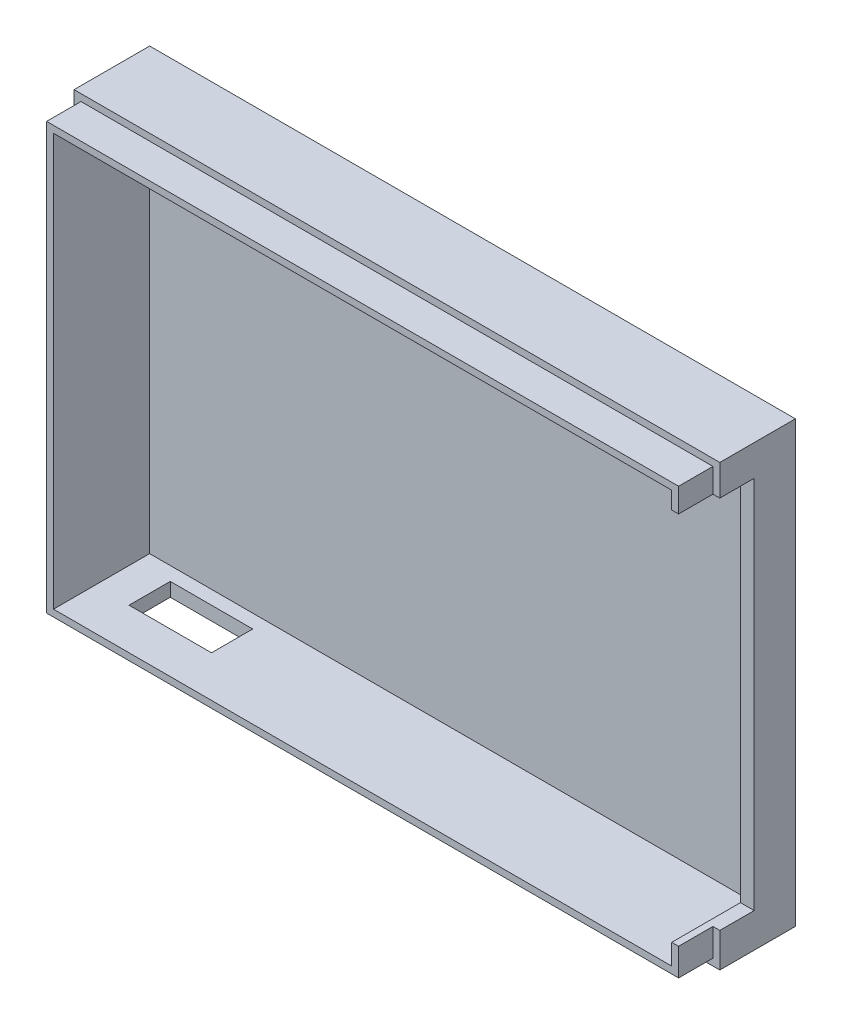
ISO-10303-21;
HEADER;
FILE_DESCRIPTION(('STEP AP214'),'2;1');
FILE_NAME('part.step','',(''),(''),'','','');
FILE_SCHEMA(('AUTOMOTIVE_DESIGN { 1 0 10303 214 1 1 1 1 }'));
ENDSEC;
DATA;
#1=APPLICATION_CONTEXT('core data for automotive mechanical design processes');
#2=APPLICATION_PROTOCOL_DEFINITION('international standard','automotive_design',2000,#1);
#3=PRODUCT_CONTEXT('',#1,'mechanical');
#4=PRODUCT('Part','Part','',(#3));
#5=PRODUCT_RELATED_PRODUCT_CATEGORY('part','',(#4));
#6=PRODUCT_DEFINITION_FORMATION('','',#4);
#7=PRODUCT_DEFINITION_CONTEXT('part definition',#1,'design');
#8=PRODUCT_DEFINITION('design','',#6,#7);
#9=PRODUCT_DEFINITION_SHAPE('','',#8);
#10=(LENGTH_UNIT() NAMED_UNIT(*) SI_UNIT(.MILLI.,.METRE.));
#11=(NAMED_UNIT(*) PLANE_ANGLE_UNIT() SI_UNIT($,.RADIAN.));
#12=(NAMED_UNIT(*) SI_UNIT($,.STERADIAN.) SOLID_ANGLE_UNIT());
#13=UNCERTAINTY_MEASURE_WITH_UNIT(LENGTH_MEASURE(1.E-05),#10,'distance_accuracy_value','');
#14=(GEOMETRIC_REPRESENTATION_CONTEXT(3) GLOBAL_UNCERTAINTY_ASSIGNED_CONTEXT((#13)) GLOBAL_UNIT_ASSIGNED_CONTEXT((#10,
#11,#12)) REPRESENTATION_CONTEXT('',''));
#15=CARTESIAN_POINT('',(0.,0.,0.));
#16=DIRECTION('',(0.,0.,1.));
#17=DIRECTION('',(1.,0.,0.));
#18=AXIS2_PLACEMENT_3D('',#15,#16,#17);
#19=CARTESIAN_POINT('',(46.,31.,11.));
#20=DIRECTION('',(1.,0.,0.));
#21=DIRECTION('',(0.,1.,0.));
#22=AXIS2_PLACEMENT_3D('',#19,#20,#21);
#23=PLANE('',#22);
#24=DIRECTION('',(0.,0.,1.));
#25=VECTOR('',#24,1.);
#26=CARTESIAN_POINT('',(46.,-27.,16.));
#27=LINE('',#26,#25);
#28=CARTESIAN_POINT('',(46.,-27.,11.));
#29=VERTEX_POINT('',#28);
#30=CARTESIAN_POINT('',(46.,-27.,16.));
#31=VERTEX_POINT('',#30);
#32=EDGE_CURVE('E362',#29,#31,#27,.T.);
#33=ORIENTED_EDGE('',*,*,#32,.T.);
#34=DIRECTION('',(0.,1.,0.));
#35=VECTOR('',#34,1.);
#36=CARTESIAN_POINT('',(46.,31.,16.));
#37=LINE('',#36,#35);
#38=CARTESIAN_POINT('',(46.,-31.,16.));
#39=VERTEX_POINT('',#38);
#40=EDGE_CURVE('E295',#39,#31,#37,.T.);
#41=ORIENTED_EDGE('',*,*,#40,.F.);
#42=DIRECTION('',(0.,0.,1.));
#43=VECTOR('',#42,1.);
#44=CARTESIAN_POINT('',(46.,-31.,11.));
#45=LINE('',#44,#43);
#46=CARTESIAN_POINT('',(46.,-31.,11.));
#47=VERTEX_POINT('',#46);
#48=EDGE_CURVE('E285',#47,#39,#45,.T.);
#49=ORIENTED_EDGE('',*,*,#48,.F.);
#50=DIRECTION('',(0.,1.,0.));
#51=VECTOR('',#50,1.);
#52=CARTESIAN_POINT('',(46.,31.,11.));
#53=LINE('',#52,#51);
#54=EDGE_CURVE('E307',#47,#29,#53,.T.);
#55=ORIENTED_EDGE('',*,*,#54,.T.);
#56=EDGE_LOOP('',(#33,#41,#49,#55));
#57=FACE_BOUND('',#56,.T.);
#58=ADVANCED_FACE('F32',(#57),#23,.T.);
#59=CARTESIAN_POINT('',(0.,0.,16.));
#60=DIRECTION('',(0.,0.,1.));
#61=DIRECTION('',(1.,0.,0.));
#62=AXIS2_PLACEMENT_3D('',#59,#60,#61);
#63=PLANE('',#62);
#64=DIRECTION('',(-1.,0.,0.));
#65=VECTOR('',#64,1.);
#66=CARTESIAN_POINT('',(47.001,-27.,16.));
#67=LINE('',#66,#65);
#68=CARTESIAN_POINT('',(45.,-27.,16.));
#69=VERTEX_POINT('',#68);
#70=EDGE_CURVE('E188',#31,#69,#67,.T.);
#71=ORIENTED_EDGE('',*,*,#70,.T.);
#72=DIRECTION('',(0.,1.,0.));
#73=VECTOR('',#72,1.);
#74=CARTESIAN_POINT('',(45.,30.,16.));
#75=LINE('',#74,#73);
#76=CARTESIAN_POINT('',(45.,-30.,16.));
#77=VERTEX_POINT('',#76);
#78=EDGE_CURVE('E234',#77,#69,#75,.T.);
#79=ORIENTED_EDGE('',*,*,#78,.F.);
#80=DIRECTION('',(1.,0.,0.));
#81=VECTOR('',#80,1.);
#82=CARTESIAN_POINT('',(-45.,-30.,16.));
#83=LINE('',#82,#81);
#84=CARTESIAN_POINT('',(-45.,-30.,16.));
#85=VERTEX_POINT('',#84);
#86=EDGE_CURVE('E230',#85,#77,#83,.T.);
#87=ORIENTED_EDGE('',*,*,#86,.F.);
#88=DIRECTION('',(0.,-1.,0.));
#89=VECTOR('',#88,1.);
#90=CARTESIAN_POINT('',(-45.,30.,16.));
#91=LINE('',#90,#89);
#92=CARTESIAN_POINT('',(-45.,30.,16.));
#93=VERTEX_POINT('',#92);
#94=EDGE_CURVE('E214',#93,#85,#91,.T.);
#95=ORIENTED_EDGE('',*,*,#94,.F.);
#96=DIRECTION('',(-1.,0.,0.));
#97=VECTOR('',#96,1.);
#98=CARTESIAN_POINT('',(-45.,30.,16.));
#99=LINE('',#98,#97);
#100=CARTESIAN_POINT('',(45.,30.,16.));
#101=VERTEX_POINT('',#100);
#102=EDGE_CURVE('E219',#101,#93,#99,.T.);
#103=ORIENTED_EDGE('',*,*,#102,.F.);
#104=CARTESIAN_POINT('',(45.,27.5,16.));
#105=VERTEX_POINT('',#104);
#106=EDGE_CURVE('E233',#105,#101,#75,.T.);
#107=ORIENTED_EDGE('',*,*,#106,.F.);
#108=DIRECTION('',(-1.,0.,0.));
#109=VECTOR('',#108,1.);
#110=CARTESIAN_POINT('',(47.001,27.5,16.));
#111=LINE('',#110,#109);
#112=CARTESIAN_POINT('',(46.,27.5,16.));
#113=VERTEX_POINT('',#112);
#114=EDGE_CURVE('E346',#113,#105,#111,.T.);
#115=ORIENTED_EDGE('',*,*,#114,.F.);
#116=CARTESIAN_POINT('',(46.,31.,16.));
#117=VERTEX_POINT('',#116);
#118=EDGE_CURVE('E298',#113,#117,#37,.T.);
#119=ORIENTED_EDGE('',*,*,#118,.T.);
#120=DIRECTION('',(-1.,0.,0.));
#121=VECTOR('',#120,1.);
#122=CARTESIAN_POINT('',(-46.,31.,16.));
#123=LINE('',#122,#121);
#124=CARTESIAN_POINT('',(-46.,31.,16.));
#125=VERTEX_POINT('',#124);
#126=EDGE_CURVE('E291',#117,#125,#123,.T.);
#127=ORIENTED_EDGE('',*,*,#126,.T.);
#128=DIRECTION('',(0.,-1.,0.));
#129=VECTOR('',#128,1.);
#130=CARTESIAN_POINT('',(-46.,31.,16.));
#131=LINE('',#130,#129);
#132=CARTESIAN_POINT('',(-46.,-31.,16.));
#133=VERTEX_POINT('',#132);
#134=EDGE_CURVE('E302',#125,#133,#131,.T.);
#135=ORIENTED_EDGE('',*,*,#134,.T.);
#136=DIRECTION('',(1.,0.,0.));
#137=VECTOR('',#136,1.);
#138=CARTESIAN_POINT('',(-46.,-31.,16.));
#139=LINE('',#138,#137);
#140=EDGE_CURVE('E299',#133,#39,#139,.T.);
#141=ORIENTED_EDGE('',*,*,#140,.T.);
#142=ORIENTED_EDGE('',*,*,#40,.T.);
#143=EDGE_LOOP('',(#71,#79,#87,#95,#103,#107,#115,#119,#127,#135,#141,#142));
#144=FACE_BOUND('',#143,.T.);
#145=ADVANCED_FACE('F391',(#144),#63,.T.);
#146=CARTESIAN_POINT('',(-45.,30.,2.));
#147=DIRECTION('',(-1.,0.,0.));
#148=DIRECTION('',(0.,-1.,0.));
#149=AXIS2_PLACEMENT_3D('',#146,#147,#148);
#150=PLANE('',#149);
#151=ORIENTED_EDGE('',*,*,#94,.T.);
#152=DIRECTION('',(0.,0.,1.));
#153=VECTOR('',#152,1.);
#154=CARTESIAN_POINT('',(-45.,-30.,2.));
#155=LINE('',#154,#153);
#156=CARTESIAN_POINT('',(-45.,-30.,2.));
#157=VERTEX_POINT('',#156);
#158=EDGE_CURVE('E228',#157,#85,#155,.T.);
#159=ORIENTED_EDGE('',*,*,#158,.F.);
#160=DIRECTION('',(0.,-1.,0.));
#161=VECTOR('',#160,1.);
#162=CARTESIAN_POINT('',(-45.,30.,2.));
#163=LINE('',#162,#161);
#164=CARTESIAN_POINT('',(-45.,30.,2.));
#165=VERTEX_POINT('',#164);
#166=EDGE_CURVE('E215',#165,#157,#163,.T.);
#167=ORIENTED_EDGE('',*,*,#166,.F.);
#168=DIRECTION('',(0.,0.,1.));
#169=VECTOR('',#168,1.);
#170=CARTESIAN_POINT('',(-45.,30.,2.));
#171=LINE('',#170,#169);
#172=EDGE_CURVE('E239',#165,#93,#171,.T.);
#173=ORIENTED_EDGE('',*,*,#172,.T.);
#174=EDGE_LOOP('',(#151,#159,#167,#173));
#175=FACE_BOUND('',#174,.T.);
#176=ADVANCED_FACE('F428',(#175),#150,.F.);
#177=CARTESIAN_POINT('',(-45.,30.,2.));
#178=DIRECTION('',(0.,1.,0.));
#179=DIRECTION('',(0.,0.,1.));
#180=AXIS2_PLACEMENT_3D('',#177,#178,#179);
#181=PLANE('',#180);
#182=ORIENTED_EDGE('',*,*,#102,.T.);
#183=ORIENTED_EDGE('',*,*,#172,.F.);
#184=DIRECTION('',(-1.,0.,0.));
#185=VECTOR('',#184,1.);
#186=CARTESIAN_POINT('',(-45.,30.,2.));
#187=LINE('',#186,#185);
#188=CARTESIAN_POINT('',(45.,30.,2.));
#189=VERTEX_POINT('',#188);
#190=EDGE_CURVE('E225',#189,#165,#187,.T.);
#191=ORIENTED_EDGE('',*,*,#190,.F.);
#192=DIRECTION('',(0.,0.,1.));
#193=VECTOR('',#192,1.);
#194=CARTESIAN_POINT('',(45.,30.,2.));
#195=LINE('',#194,#193);
#196=EDGE_CURVE('E242',#189,#101,#195,.T.);
#197=ORIENTED_EDGE('',*,*,#196,.T.);
#198=EDGE_LOOP('',(#182,#183,#191,#197));
#199=FACE_BOUND('',#198,.T.);
#200=ADVANCED_FACE('F400',(#199),#181,.F.);
#201=CARTESIAN_POINT('',(45.,30.,2.));
#202=DIRECTION('',(1.,0.,0.));
#203=DIRECTION('',(0.,1.,0.));
#204=AXIS2_PLACEMENT_3D('',#201,#202,#203);
#205=PLANE('',#204);
#206=ORIENTED_EDGE('',*,*,#78,.T.);
#207=DIRECTION('',(0.,0.,1.));
#208=VECTOR('',#207,1.);
#209=CARTESIAN_POINT('',(45.,-27.,16.));
#210=LINE('',#209,#208);
#211=CARTESIAN_POINT('',(45.,-27.,6.00000000000001));
#212=VERTEX_POINT('',#211);
#213=EDGE_CURVE('E348',#212,#69,#210,.T.);
#214=ORIENTED_EDGE('',*,*,#213,.F.);
#215=DIRECTION('',(0.,-1.,0.));
#216=VECTOR('',#215,1.);
#217=CARTESIAN_POINT('',(45.,27.5,6.));
#218=LINE('',#217,#216);
#219=CARTESIAN_POINT('',(45.,27.5,6.));
#220=VERTEX_POINT('',#219);
#221=EDGE_CURVE('E355',#220,#212,#218,.T.);
#222=ORIENTED_EDGE('',*,*,#221,.F.);
#223=DIRECTION('',(0.,0.,-1.));
#224=VECTOR('',#223,1.);
#225=CARTESIAN_POINT('',(45.,27.5,16.));
#226=LINE('',#225,#224);
#227=EDGE_CURVE('E358',#105,#220,#226,.T.);
#228=ORIENTED_EDGE('',*,*,#227,.F.);
#229=ORIENTED_EDGE('',*,*,#106,.T.);
#230=ORIENTED_EDGE('',*,*,#196,.F.);
#231=DIRECTION('',(0.,1.,0.));
#232=VECTOR('',#231,1.);
#233=CARTESIAN_POINT('',(45.,30.,2.));
#234=LINE('',#233,#232);
#235=CARTESIAN_POINT('',(45.,-30.,2.));
#236=VERTEX_POINT('',#235);
#237=EDGE_CURVE('E222',#236,#189,#234,.T.);
#238=ORIENTED_EDGE('',*,*,#237,.F.);
#239=DIRECTION('',(0.,0.,1.));
#240=VECTOR('',#239,1.);
#241=CARTESIAN_POINT('',(45.,-30.,2.));
#242=LINE('',#241,#240);
#243=EDGE_CURVE('E245',#236,#77,#242,.T.);
#244=ORIENTED_EDGE('',*,*,#243,.T.);
#245=EDGE_LOOP('',(#206,#214,#222,#228,#229,#230,#238,#244));
#246=FACE_BOUND('',#245,.T.);
#247=ADVANCED_FACE('F395',(#246),#205,.F.);
#248=CARTESIAN_POINT('',(-45.,-30.,2.));
#249=DIRECTION('',(0.,-1.,0.));
#250=DIRECTION('',(0.,0.,-1.));
#251=AXIS2_PLACEMENT_3D('',#248,#249,#250);
#252=PLANE('',#251);
#253=DIRECTION('',(1.,0.,0.));
#254=VECTOR('',#253,1.);
#255=CARTESIAN_POINT('',(-40.,-30.,10.));
#256=LINE('',#255,#254);
#257=CARTESIAN_POINT('',(-40.,-30.,10.));
#258=VERTEX_POINT('',#257);
#259=CARTESIAN_POINT('',(-28.,-30.,10.));
#260=VERTEX_POINT('',#259);
#261=EDGE_CURVE('E326',#258,#260,#256,.T.);
#262=ORIENTED_EDGE('',*,*,#261,.F.);
#263=DIRECTION('',(0.,0.,1.));
#264=VECTOR('',#263,1.);
#265=CARTESIAN_POINT('',(-40.,-30.,10.));
#266=LINE('',#265,#264);
#267=CARTESIAN_POINT('',(-40.,-30.,4.));
#268=VERTEX_POINT('',#267);
#269=EDGE_CURVE('E329',#268,#258,#266,.T.);
#270=ORIENTED_EDGE('',*,*,#269,.F.);
#271=DIRECTION('',(-1.,0.,0.));
#272=VECTOR('',#271,1.);
#273=CARTESIAN_POINT('',(-40.,-30.,4.));
#274=LINE('',#273,#272);
#275=CARTESIAN_POINT('',(-28.,-30.,4.));
#276=VERTEX_POINT('',#275);
#277=EDGE_CURVE('E332',#276,#268,#274,.T.);
#278=ORIENTED_EDGE('',*,*,#277,.F.);
#279=DIRECTION('',(0.,0.,-1.));
#280=VECTOR('',#279,1.);
#281=CARTESIAN_POINT('',(-28.,-30.,10.));
#282=LINE('',#281,#280);
#283=EDGE_CURVE('E55',#260,#276,#282,.T.);
#284=ORIENTED_EDGE('',*,*,#283,.F.);
#285=EDGE_LOOP('',(#262,#270,#278,#284));
#286=FACE_BOUND('',#285,.T.);
#287=ORIENTED_EDGE('',*,*,#86,.T.);
#288=ORIENTED_EDGE('',*,*,#243,.F.);
#289=DIRECTION('',(1.,0.,0.));
#290=VECTOR('',#289,1.);
#291=CARTESIAN_POINT('',(-45.,-30.,2.));
#292=LINE('',#291,#290);
#293=EDGE_CURVE('E218',#157,#236,#292,.T.);
#294=ORIENTED_EDGE('',*,*,#293,.F.);
#295=ORIENTED_EDGE('',*,*,#158,.T.);
#296=EDGE_LOOP('',(#287,#288,#294,#295));
#297=FACE_BOUND('',#296,.T.);
#298=ADVANCED_FACE('F409',(#286,#297),#252,.F.);
#299=CARTESIAN_POINT('',(0.,0.,2.));
#300=DIRECTION('',(0.,0.,1.));
#301=DIRECTION('',(1.,0.,0.));
#302=AXIS2_PLACEMENT_3D('',#299,#300,#301);
#303=PLANE('',#302);
#304=ORIENTED_EDGE('',*,*,#166,.T.);
#305=ORIENTED_EDGE('',*,*,#293,.T.);
#306=ORIENTED_EDGE('',*,*,#237,.T.);
#307=ORIENTED_EDGE('',*,*,#190,.T.);
#308=EDGE_LOOP('',(#304,#305,#306,#307));
#309=FACE_BOUND('',#308,.T.);
#310=ADVANCED_FACE('F403',(#309),#303,.T.);
#311=CARTESIAN_POINT('',(0.,0.,11.));
#312=DIRECTION('',(0.,0.,1.));
#313=DIRECTION('',(1.,0.,0.));
#314=AXIS2_PLACEMENT_3D('',#311,#312,#313);
#315=PLANE('',#314);
#316=DIRECTION('',(-1.,0.,0.));
#317=VECTOR('',#316,1.);
#318=CARTESIAN_POINT('',(47.001,-27.,11.));
#319=LINE('',#318,#317);
#320=CARTESIAN_POINT('',(47.,-27.,11.));
#321=VERTEX_POINT('',#320);
#322=EDGE_CURVE('E360',#321,#29,#319,.T.);
#323=ORIENTED_EDGE('',*,*,#322,.T.);
#324=ORIENTED_EDGE('',*,*,#54,.F.);
#325=DIRECTION('',(1.,0.,0.));
#326=VECTOR('',#325,1.);
#327=CARTESIAN_POINT('',(-46.,-31.,11.));
#328=LINE('',#327,#326);
#329=CARTESIAN_POINT('',(-46.,-31.,11.));
#330=VERTEX_POINT('',#329);
#331=EDGE_CURVE('E310',#330,#47,#328,.T.);
#332=ORIENTED_EDGE('',*,*,#331,.F.);
#333=DIRECTION('',(0.,-1.,0.));
#334=VECTOR('',#333,1.);
#335=CARTESIAN_POINT('',(-46.,31.,11.));
#336=LINE('',#335,#334);
#337=CARTESIAN_POINT('',(-46.,31.,11.));
#338=VERTEX_POINT('',#337);
#339=EDGE_CURVE('E294',#338,#330,#336,.T.);
#340=ORIENTED_EDGE('',*,*,#339,.F.);
#341=DIRECTION('',(-1.,0.,0.));
#342=VECTOR('',#341,1.);
#343=CARTESIAN_POINT('',(-46.,31.,11.));
#344=LINE('',#343,#342);
#345=CARTESIAN_POINT('',(46.,31.,11.));
#346=VERTEX_POINT('',#345);
#347=EDGE_CURVE('E286',#346,#338,#344,.T.);
#348=ORIENTED_EDGE('',*,*,#347,.F.);
#349=CARTESIAN_POINT('',(46.,27.5,11.));
#350=VERTEX_POINT('',#349);
#351=EDGE_CURVE('E197',#350,#346,#53,.T.);
#352=ORIENTED_EDGE('',*,*,#351,.F.);
#353=DIRECTION('',(1.,0.,0.));
#354=VECTOR('',#353,1.);
#355=CARTESIAN_POINT('',(47.001,27.5,11.));
#356=LINE('',#355,#354);
#357=CARTESIAN_POINT('',(47.,27.5,11.));
#358=VERTEX_POINT('',#357);
#359=EDGE_CURVE('E182',#350,#358,#356,.T.);
#360=ORIENTED_EDGE('',*,*,#359,.T.);
#361=DIRECTION('',(0.,1.,0.));
#362=VECTOR('',#361,1.);
#363=CARTESIAN_POINT('',(47.,32.,11.));
#364=LINE('',#363,#362);
#365=CARTESIAN_POINT('',(47.,32.,11.));
#366=VERTEX_POINT('',#365);
#367=EDGE_CURVE('E194',#358,#366,#364,.T.);
#368=ORIENTED_EDGE('',*,*,#367,.T.);
#369=DIRECTION('',(-1.,0.,0.));
#370=VECTOR('',#369,1.);
#371=CARTESIAN_POINT('',(-47.,32.,11.));
#372=LINE('',#371,#370);
#373=CARTESIAN_POINT('',(-47.,32.,11.));
#374=VERTEX_POINT('',#373);
#375=EDGE_CURVE('E208',#366,#374,#372,.T.);
#376=ORIENTED_EDGE('',*,*,#375,.T.);
#377=DIRECTION('',(0.,-1.,0.));
#378=VECTOR('',#377,1.);
#379=CARTESIAN_POINT('',(-47.,32.,11.));
#380=LINE('',#379,#378);
#381=CARTESIAN_POINT('',(-47.,-32.,11.));
#382=VERTEX_POINT('',#381);
#383=EDGE_CURVE('E209',#374,#382,#380,.T.);
#384=ORIENTED_EDGE('',*,*,#383,.T.);
#385=DIRECTION('',(1.,0.,0.));
#386=VECTOR('',#385,1.);
#387=CARTESIAN_POINT('',(-47.,-32.,11.));
#388=LINE('',#387,#386);
#389=CARTESIAN_POINT('',(47.,-32.,11.));
#390=VERTEX_POINT('',#389);
#391=EDGE_CURVE('E205',#382,#390,#388,.T.);
#392=ORIENTED_EDGE('',*,*,#391,.T.);
#393=EDGE_CURVE('E204',#390,#321,#364,.T.);
#394=ORIENTED_EDGE('',*,*,#393,.T.);
#395=EDGE_LOOP('',(#323,#324,#332,#340,#348,#352,#360,#368,#376,#384,#392,#394));
#396=FACE_BOUND('',#395,.T.);
#397=ADVANCED_FACE('F193',(#396),#315,.T.);
#398=CARTESIAN_POINT('',(-46.,31.,11.));
#399=DIRECTION('',(-1.,0.,0.));
#400=DIRECTION('',(0.,-1.,0.));
#401=AXIS2_PLACEMENT_3D('',#398,#399,#400);
#402=PLANE('',#401);
#403=ORIENTED_EDGE('',*,*,#134,.F.);
#404=DIRECTION('',(0.,0.,1.));
#405=VECTOR('',#404,1.);
#406=CARTESIAN_POINT('',(-46.,31.,11.));
#407=LINE('',#406,#405);
#408=EDGE_CURVE('E279',#338,#125,#407,.T.);
#409=ORIENTED_EDGE('',*,*,#408,.F.);
#410=ORIENTED_EDGE('',*,*,#339,.T.);
#411=DIRECTION('',(0.,0.,1.));
#412=VECTOR('',#411,1.);
#413=CARTESIAN_POINT('',(-46.,-31.,11.));
#414=LINE('',#413,#412);
#415=EDGE_CURVE('E283',#330,#133,#414,.T.);
#416=ORIENTED_EDGE('',*,*,#415,.T.);
#417=EDGE_LOOP('',(#403,#409,#410,#416));
#418=FACE_BOUND('',#417,.T.);
#419=ADVANCED_FACE('F379',(#418),#402,.T.);
#420=CARTESIAN_POINT('',(-46.,31.,11.));
#421=DIRECTION('',(0.,1.,0.));
#422=DIRECTION('',(0.,0.,1.));
#423=AXIS2_PLACEMENT_3D('',#420,#421,#422);
#424=PLANE('',#423);
#425=ORIENTED_EDGE('',*,*,#126,.F.);
#426=DIRECTION('',(0.,0.,1.));
#427=VECTOR('',#426,1.);
#428=CARTESIAN_POINT('',(46.,31.,11.));
#429=LINE('',#428,#427);
#430=EDGE_CURVE('E280',#346,#117,#429,.T.);
#431=ORIENTED_EDGE('',*,*,#430,.F.);
#432=ORIENTED_EDGE('',*,*,#347,.T.);
#433=ORIENTED_EDGE('',*,*,#408,.T.);
#434=EDGE_LOOP('',(#425,#431,#432,#433));
#435=FACE_BOUND('',#434,.T.);
#436=ADVANCED_FACE('F382',(#435),#424,.T.);
#437=DIRECTION('',(0.,0.,-1.));
#438=VECTOR('',#437,1.);
#439=CARTESIAN_POINT('',(46.,27.5,16.));
#440=LINE('',#439,#438);
#441=EDGE_CURVE('E198',#113,#350,#440,.T.);
#442=ORIENTED_EDGE('',*,*,#441,.T.);
#443=ORIENTED_EDGE('',*,*,#351,.T.);
#444=ORIENTED_EDGE('',*,*,#430,.T.);
#445=ORIENTED_EDGE('',*,*,#118,.F.);
#446=EDGE_LOOP('',(#442,#443,#444,#445));
#447=FACE_BOUND('',#446,.T.);
#448=ADVANCED_FACE('F386',(#447),#23,.T.);
#449=CARTESIAN_POINT('',(-46.,-31.,11.));
#450=DIRECTION('',(0.,-1.,0.));
#451=DIRECTION('',(1.,0.,0.));
#452=AXIS2_PLACEMENT_3D('',#449,#450,#451);
#453=PLANE('',#452);
#454=ORIENTED_EDGE('',*,*,#140,.F.);
#455=ORIENTED_EDGE('',*,*,#415,.F.);
#456=ORIENTED_EDGE('',*,*,#331,.T.);
#457=ORIENTED_EDGE('',*,*,#48,.T.);
#458=EDGE_LOOP('',(#454,#455,#456,#457));
#459=FACE_BOUND('',#458,.T.);
#460=ADVANCED_FACE('F375',(#459),#453,.T.);
#461=CARTESIAN_POINT('',(0.,0.,0.));
#462=DIRECTION('',(0.,0.,1.));
#463=DIRECTION('',(1.,0.,0.));
#464=AXIS2_PLACEMENT_3D('',#461,#462,#463);
#465=PLANE('',#464);
#466=DIRECTION('',(0.,-1.,0.));
#467=VECTOR('',#466,1.);
#468=CARTESIAN_POINT('',(-47.,32.,0.));
#469=LINE('',#468,#467);
#470=CARTESIAN_POINT('',(-47.,32.,0.));
#471=VERTEX_POINT('',#470);
#472=CARTESIAN_POINT('',(-47.,-32.,0.));
#473=VERTEX_POINT('',#472);
#474=EDGE_CURVE('E241',#471,#473,#469,.T.);
#475=ORIENTED_EDGE('',*,*,#474,.F.);
#476=DIRECTION('',(-1.,0.,0.));
#477=VECTOR('',#476,1.);
#478=CARTESIAN_POINT('',(-47.,32.,0.));
#479=LINE('',#478,#477);
#480=CARTESIAN_POINT('',(47.,32.,0.));
#481=VERTEX_POINT('',#480);
#482=EDGE_CURVE('E256',#481,#471,#479,.T.);
#483=ORIENTED_EDGE('',*,*,#482,.F.);
#484=DIRECTION('',(0.,1.,0.));
#485=VECTOR('',#484,1.);
#486=CARTESIAN_POINT('',(47.,32.,0.));
#487=LINE('',#486,#485);
#488=CARTESIAN_POINT('',(47.,-32.,0.));
#489=VERTEX_POINT('',#488);
#490=EDGE_CURVE('E254',#489,#481,#487,.T.);
#491=ORIENTED_EDGE('',*,*,#490,.F.);
#492=DIRECTION('',(1.,0.,0.));
#493=VECTOR('',#492,1.);
#494=CARTESIAN_POINT('',(-47.,-32.,0.));
#495=LINE('',#494,#493);
#496=EDGE_CURVE('E251',#473,#489,#495,.T.);
#497=ORIENTED_EDGE('',*,*,#496,.F.);
#498=EDGE_LOOP('',(#475,#483,#491,#497));
#499=FACE_BOUND('',#498,.T.);
#500=ADVANCED_FACE('F273',(#499),#465,.F.);
#501=CARTESIAN_POINT('',(-47.,32.,16.));
#502=DIRECTION('',(0.,-1.,0.));
#503=DIRECTION('',(0.,0.,-1.));
#504=AXIS2_PLACEMENT_3D('',#501,#502,#503);
#505=PLANE('',#504);
#506=ORIENTED_EDGE('',*,*,#375,.F.);
#507=DIRECTION('',(0.,0.,-1.));
#508=VECTOR('',#507,1.);
#509=CARTESIAN_POINT('',(47.,32.,16.));
#510=LINE('',#509,#508);
#511=EDGE_CURVE('E203',#366,#481,#510,.T.);
#512=ORIENTED_EDGE('',*,*,#511,.T.);
#513=ORIENTED_EDGE('',*,*,#482,.T.);
#514=DIRECTION('',(0.,0.,-1.));
#515=VECTOR('',#514,1.);
#516=CARTESIAN_POINT('',(-47.,32.,16.));
#517=LINE('',#516,#515);
#518=EDGE_CURVE('E259',#374,#471,#517,.T.);
#519=ORIENTED_EDGE('',*,*,#518,.F.);
#520=EDGE_LOOP('',(#506,#512,#513,#519));
#521=FACE_BOUND('',#520,.T.);
#522=ADVANCED_FACE('F276',(#521),#505,.F.);
#523=CARTESIAN_POINT('',(47.,32.,16.));
#524=DIRECTION('',(-1.,0.,0.));
#525=DIRECTION('',(0.,-1.,0.));
#526=AXIS2_PLACEMENT_3D('',#523,#524,#525);
#527=PLANE('',#526);
#528=DIRECTION('',(0.,1.,0.));
#529=VECTOR('',#528,1.);
#530=CARTESIAN_POINT('',(47.,27.5,6.));
#531=LINE('',#530,#529);
#532=CARTESIAN_POINT('',(47.,-27.,6.00000000000001));
#533=VERTEX_POINT('',#532);
#534=CARTESIAN_POINT('',(47.,27.5,6.));
#535=VERTEX_POINT('',#534);
#536=EDGE_CURVE('E47',#533,#535,#531,.T.);
#537=ORIENTED_EDGE('',*,*,#536,.F.);
#538=DIRECTION('',(0.,0.,-1.));
#539=VECTOR('',#538,1.);
#540=CARTESIAN_POINT('',(47.,-27.,16.));
#541=LINE('',#540,#539);
#542=EDGE_CURVE('E365',#321,#533,#541,.T.);
#543=ORIENTED_EDGE('',*,*,#542,.F.);
#544=ORIENTED_EDGE('',*,*,#393,.F.);
#545=DIRECTION('',(0.,0.,-1.));
#546=VECTOR('',#545,1.);
#547=CARTESIAN_POINT('',(47.,-32.,16.));
#548=LINE('',#547,#546);
#549=EDGE_CURVE('E40',#390,#489,#548,.T.);
#550=ORIENTED_EDGE('',*,*,#549,.T.);
#551=ORIENTED_EDGE('',*,*,#490,.T.);
#552=ORIENTED_EDGE('',*,*,#511,.F.);
#553=ORIENTED_EDGE('',*,*,#367,.F.);
#554=DIRECTION('',(0.,0.,1.));
#555=VECTOR('',#554,1.);
#556=CARTESIAN_POINT('',(47.,27.5,16.));
#557=LINE('',#556,#555);
#558=EDGE_CURVE('E179',#535,#358,#557,.T.);
#559=ORIENTED_EDGE('',*,*,#558,.F.);
#560=EDGE_LOOP('',(#537,#543,#544,#550,#551,#552,#553,#559));
#561=FACE_BOUND('',#560,.T.);
#562=ADVANCED_FACE('F201',(#561),#527,.F.);
#563=CARTESIAN_POINT('',(-47.,-32.,16.));
#564=DIRECTION('',(0.,1.,0.));
#565=DIRECTION('',(0.,0.,1.));
#566=AXIS2_PLACEMENT_3D('',#563,#564,#565);
#567=PLANE('',#566);
#568=DIRECTION('',(1.,0.,0.));
#569=VECTOR('',#568,1.);
#570=CARTESIAN_POINT('',(-40.,-32.,4.));
#571=LINE('',#570,#569);
#572=CARTESIAN_POINT('',(-40.,-32.,4.));
#573=VERTEX_POINT('',#572);
#574=CARTESIAN_POINT('',(-28.,-32.,4.));
#575=VERTEX_POINT('',#574);
#576=EDGE_CURVE('E334',#573,#575,#571,.T.);
#577=ORIENTED_EDGE('',*,*,#576,.F.);
#578=DIRECTION('',(0.,0.,-1.));
#579=VECTOR('',#578,1.);
#580=CARTESIAN_POINT('',(-40.,-32.,10.));
#581=LINE('',#580,#579);
#582=CARTESIAN_POINT('',(-40.,-32.,10.));
#583=VERTEX_POINT('',#582);
#584=EDGE_CURVE('E321',#583,#573,#581,.T.);
#585=ORIENTED_EDGE('',*,*,#584,.F.);
#586=DIRECTION('',(-1.,0.,0.));
#587=VECTOR('',#586,1.);
#588=CARTESIAN_POINT('',(-40.,-32.,10.));
#589=LINE('',#588,#587);
#590=CARTESIAN_POINT('',(-28.,-32.,10.));
#591=VERTEX_POINT('',#590);
#592=EDGE_CURVE('E340',#591,#583,#589,.T.);
#593=ORIENTED_EDGE('',*,*,#592,.F.);
#594=DIRECTION('',(0.,0.,1.));
#595=VECTOR('',#594,1.);
#596=CARTESIAN_POINT('',(-28.,-32.,10.));
#597=LINE('',#596,#595);
#598=EDGE_CURVE('E337',#575,#591,#597,.T.);
#599=ORIENTED_EDGE('',*,*,#598,.F.);
#600=EDGE_LOOP('',(#577,#585,#593,#599));
#601=FACE_BOUND('',#600,.T.);
#602=ORIENTED_EDGE('',*,*,#391,.F.);
#603=DIRECTION('',(0.,0.,-1.));
#604=VECTOR('',#603,1.);
#605=CARTESIAN_POINT('',(-47.,-32.,16.));
#606=LINE('',#605,#604);
#607=EDGE_CURVE('E11',#382,#473,#606,.T.);
#608=ORIENTED_EDGE('',*,*,#607,.T.);
#609=ORIENTED_EDGE('',*,*,#496,.T.);
#610=ORIENTED_EDGE('',*,*,#549,.F.);
#611=EDGE_LOOP('',(#602,#608,#609,#610));
#612=FACE_BOUND('',#611,.T.);
#613=ADVANCED_FACE('F269',(#601,#612),#567,.F.);
#614=CARTESIAN_POINT('',(-47.,32.,16.));
#615=DIRECTION('',(1.,0.,0.));
#616=DIRECTION('',(0.,1.,0.));
#617=AXIS2_PLACEMENT_3D('',#614,#615,#616);
#618=PLANE('',#617);
#619=ORIENTED_EDGE('',*,*,#383,.F.);
#620=ORIENTED_EDGE('',*,*,#518,.T.);
#621=ORIENTED_EDGE('',*,*,#474,.T.);
#622=ORIENTED_EDGE('',*,*,#607,.F.);
#623=EDGE_LOOP('',(#619,#620,#621,#622));
#624=FACE_BOUND('',#623,.T.);
#625=ADVANCED_FACE('F34',(#624),#618,.F.);
#626=CARTESIAN_POINT('',(-40.,32.001,10.));
#627=DIRECTION('',(-1.,0.,0.));
#628=DIRECTION('',(0.,0.,1.));
#629=AXIS2_PLACEMENT_3D('',#626,#627,#628);
#630=PLANE('',#629);
#631=ORIENTED_EDGE('',*,*,#269,.T.);
#632=DIRECTION('',(0.,-1.,0.));
#633=VECTOR('',#632,1.);
#634=CARTESIAN_POINT('',(-40.,32.001,10.));
#635=LINE('',#634,#633);
#636=EDGE_CURVE('E318',#258,#583,#635,.T.);
#637=ORIENTED_EDGE('',*,*,#636,.T.);
#638=ORIENTED_EDGE('',*,*,#584,.T.);
#639=DIRECTION('',(0.,-1.,0.));
#640=VECTOR('',#639,1.);
#641=CARTESIAN_POINT('',(-40.,32.001,4.));
#642=LINE('',#641,#640);
#643=EDGE_CURVE('E315',#268,#573,#642,.T.);
#644=ORIENTED_EDGE('',*,*,#643,.F.);
#645=EDGE_LOOP('',(#631,#637,#638,#644));
#646=FACE_BOUND('',#645,.T.);
#647=ADVANCED_FACE('F442',(#646),#630,.F.);
#648=CARTESIAN_POINT('',(-40.,32.001,10.));
#649=DIRECTION('',(0.,0.,1.));
#650=DIRECTION('',(1.,0.,0.));
#651=AXIS2_PLACEMENT_3D('',#648,#649,#650);
#652=PLANE('',#651);
#653=ORIENTED_EDGE('',*,*,#261,.T.);
#654=DIRECTION('',(0.,-1.,0.));
#655=VECTOR('',#654,1.);
#656=CARTESIAN_POINT('',(-28.,32.001,10.));
#657=LINE('',#656,#655);
#658=EDGE_CURVE('E322',#260,#591,#657,.T.);
#659=ORIENTED_EDGE('',*,*,#658,.T.);
#660=ORIENTED_EDGE('',*,*,#592,.T.);
#661=ORIENTED_EDGE('',*,*,#636,.F.);
#662=EDGE_LOOP('',(#653,#659,#660,#661));
#663=FACE_BOUND('',#662,.T.);
#664=ADVANCED_FACE('F445',(#663),#652,.F.);
#665=CARTESIAN_POINT('',(-28.,32.001,10.));
#666=DIRECTION('',(1.,0.,0.));
#667=DIRECTION('',(0.,0.,-1.));
#668=AXIS2_PLACEMENT_3D('',#665,#666,#667);
#669=PLANE('',#668);
#670=ORIENTED_EDGE('',*,*,#283,.T.);
#671=DIRECTION('',(0.,-1.,0.));
#672=VECTOR('',#671,1.);
#673=CARTESIAN_POINT('',(-28.,32.001,4.));
#674=LINE('',#673,#672);
#675=EDGE_CURVE('E319',#276,#575,#674,.T.);
#676=ORIENTED_EDGE('',*,*,#675,.T.);
#677=ORIENTED_EDGE('',*,*,#598,.T.);
#678=ORIENTED_EDGE('',*,*,#658,.F.);
#679=EDGE_LOOP('',(#670,#676,#677,#678));
#680=FACE_BOUND('',#679,.T.);
#681=ADVANCED_FACE('F419',(#680),#669,.F.);
#682=CARTESIAN_POINT('',(-40.,32.001,4.));
#683=DIRECTION('',(0.,0.,-1.));
#684=DIRECTION('',(-1.,0.,0.));
#685=AXIS2_PLACEMENT_3D('',#682,#683,#684);
#686=PLANE('',#685);
#687=ORIENTED_EDGE('',*,*,#277,.T.);
#688=ORIENTED_EDGE('',*,*,#643,.T.);
#689=ORIENTED_EDGE('',*,*,#576,.T.);
#690=ORIENTED_EDGE('',*,*,#675,.F.);
#691=EDGE_LOOP('',(#687,#688,#689,#690));
#692=FACE_BOUND('',#691,.T.);
#693=ADVANCED_FACE('F412',(#692),#686,.F.);
#694=CARTESIAN_POINT('',(47.001,27.5,6.));
#695=DIRECTION('',(0.,0.,-1.));
#696=DIRECTION('',(0.,1.,0.));
#697=AXIS2_PLACEMENT_3D('',#694,#695,#696);
#698=PLANE('',#697);
#699=ORIENTED_EDGE('',*,*,#536,.T.);
#700=DIRECTION('',(-1.,0.,0.));
#701=VECTOR('',#700,1.);
#702=CARTESIAN_POINT('',(47.001,27.5,6.));
#703=LINE('',#702,#701);
#704=EDGE_CURVE('E185',#535,#220,#703,.T.);
#705=ORIENTED_EDGE('',*,*,#704,.T.);
#706=ORIENTED_EDGE('',*,*,#221,.T.);
#707=DIRECTION('',(-1.,0.,0.));
#708=VECTOR('',#707,1.);
#709=CARTESIAN_POINT('',(47.001,-27.,6.00000000000001));
#710=LINE('',#709,#708);
#711=EDGE_CURVE('E350',#533,#212,#710,.T.);
#712=ORIENTED_EDGE('',*,*,#711,.F.);
#713=EDGE_LOOP('',(#699,#705,#706,#712));
#714=FACE_BOUND('',#713,.T.);
#715=ADVANCED_FACE('F410',(#714),#698,.F.);
#716=CARTESIAN_POINT('',(47.001,-27.,16.));
#717=DIRECTION('',(0.,-1.,0.));
#718=DIRECTION('',(1.,0.,0.));
#719=AXIS2_PLACEMENT_3D('',#716,#717,#718);
#720=PLANE('',#719);
#721=ORIENTED_EDGE('',*,*,#322,.F.);
#722=ORIENTED_EDGE('',*,*,#542,.T.);
#723=ORIENTED_EDGE('',*,*,#711,.T.);
#724=ORIENTED_EDGE('',*,*,#213,.T.);
#725=ORIENTED_EDGE('',*,*,#70,.F.);
#726=ORIENTED_EDGE('',*,*,#32,.F.);
#727=EDGE_LOOP('',(#721,#722,#723,#724,#725,#726));
#728=FACE_BOUND('',#727,.T.);
#729=ADVANCED_FACE('F369',(#728),#720,.F.);
#730=CARTESIAN_POINT('',(47.001,27.5,16.));
#731=DIRECTION('',(0.,1.,0.));
#732=DIRECTION('',(-1.,0.,0.));
#733=AXIS2_PLACEMENT_3D('',#730,#731,#732);
#734=PLANE('',#733);
#735=ORIENTED_EDGE('',*,*,#114,.T.);
#736=ORIENTED_EDGE('',*,*,#227,.T.);
#737=ORIENTED_EDGE('',*,*,#704,.F.);
#738=ORIENTED_EDGE('',*,*,#558,.T.);
#739=ORIENTED_EDGE('',*,*,#359,.F.);
#740=ORIENTED_EDGE('',*,*,#441,.F.);
#741=EDGE_LOOP('',(#735,#736,#737,#738,#739,#740));
#742=FACE_BOUND('',#741,.T.);
#743=ADVANCED_FACE('F181',(#742),#734,.F.);
#744=CLOSED_SHELL('',(#58,#145,#176,#200,#247,#298,#310,#397,#419,#436,#448,#460,#500,#522,#562,
#613,#625,#647,#664,#681,#693,#715,#729,#743));
#745=MANIFOLD_SOLID_BREP('B2',#744);
#746=ADVANCED_BREP_SHAPE_REPRESENTATION('',(#18,#745),#14);
#747=SHAPE_DEFINITION_REPRESENTATION(#9,#746);
ENDSEC;
END-ISO-10303-21;
